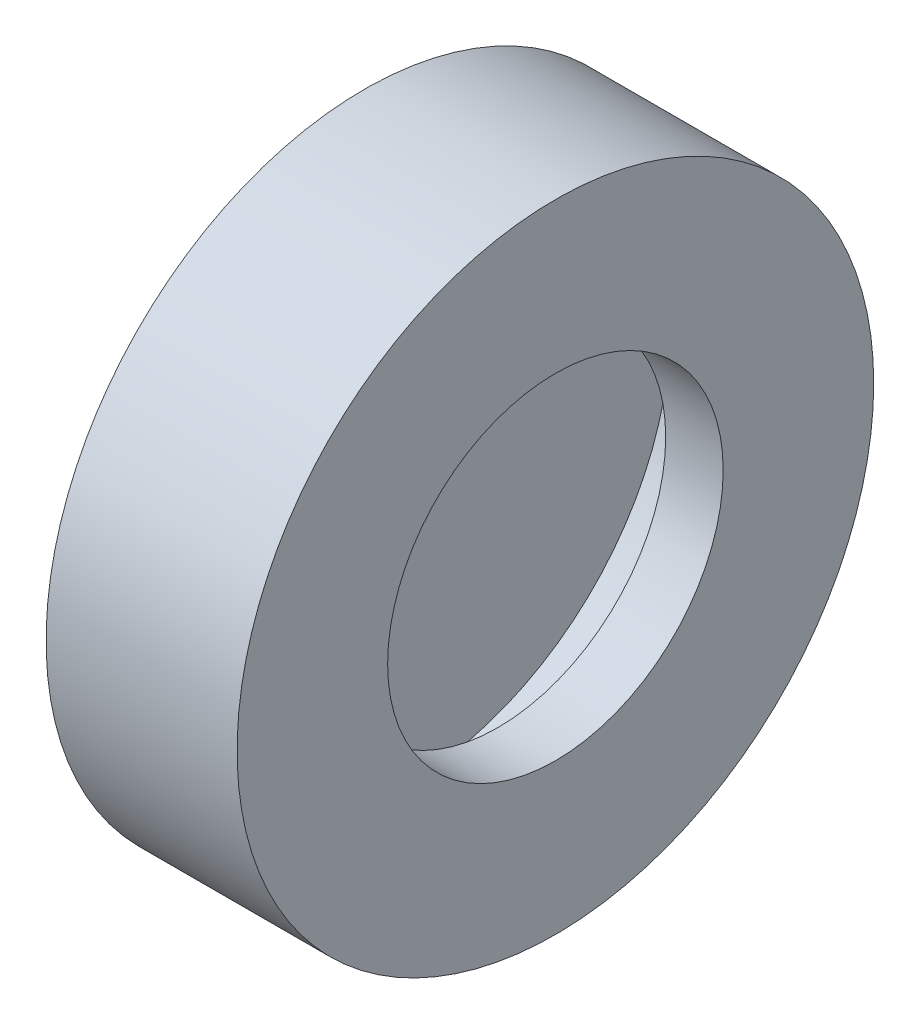
ISO-10303-21;
HEADER;
FILE_DESCRIPTION(('STEP AP214'),'2;1');
FILE_NAME('part.step','',(''),(''),'','','');
FILE_SCHEMA(('AUTOMOTIVE_DESIGN { 1 0 10303 214 1 1 1 1 }'));
ENDSEC;
DATA;
#1=APPLICATION_CONTEXT('core data for automotive mechanical design processes');
#2=APPLICATION_PROTOCOL_DEFINITION('international standard','automotive_design',2000,#1);
#3=PRODUCT_CONTEXT('',#1,'mechanical');
#4=PRODUCT('Part','Part','',(#3));
#5=PRODUCT_RELATED_PRODUCT_CATEGORY('part','',(#4));
#6=PRODUCT_DEFINITION_FORMATION('','',#4);
#7=PRODUCT_DEFINITION_CONTEXT('part definition',#1,'design');
#8=PRODUCT_DEFINITION('design','',#6,#7);
#9=PRODUCT_DEFINITION_SHAPE('','',#8);
#10=(LENGTH_UNIT() NAMED_UNIT(*) SI_UNIT(.MILLI.,.METRE.));
#11=(NAMED_UNIT(*) PLANE_ANGLE_UNIT() SI_UNIT($,.RADIAN.));
#12=(NAMED_UNIT(*) SI_UNIT($,.STERADIAN.) SOLID_ANGLE_UNIT());
#13=UNCERTAINTY_MEASURE_WITH_UNIT(LENGTH_MEASURE(1.E-05),#10,'distance_accuracy_value','');
#14=(GEOMETRIC_REPRESENTATION_CONTEXT(3) GLOBAL_UNCERTAINTY_ASSIGNED_CONTEXT((#13)) GLOBAL_UNIT_ASSIGNED_CONTEXT((#10,
#11,#12)) REPRESENTATION_CONTEXT('',''));
#15=CARTESIAN_POINT('',(0.,0.,0.));
#16=DIRECTION('',(0.,0.,1.));
#17=DIRECTION('',(1.,0.,0.));
#18=AXIS2_PLACEMENT_3D('',#15,#16,#17);
#19=CARTESIAN_POINT('',(3.,0.,0.));
#20=DIRECTION('',(-1.,0.,0.));
#21=DIRECTION('',(0.,0.,1.));
#22=AXIS2_PLACEMENT_3D('',#19,#20,#21);
#23=CYLINDRICAL_SURFACE('',#22,5.);
#24=CARTESIAN_POINT('',(3.,0.,0.));
#25=DIRECTION('',(1.,0.,0.));
#26=DIRECTION('',(0.,0.,-1.));
#27=AXIS2_PLACEMENT_3D('',#24,#25,#26);
#28=CIRCLE('',#27,5.);
#29=CARTESIAN_POINT('',(3.,0.,-5.));
#30=VERTEX_POINT('',#29);
#31=EDGE_CURVE('E10',#30,#30,#28,.T.);
#32=ORIENTED_EDGE('',*,*,#31,.F.);
#33=EDGE_LOOP('',(#32));
#34=FACE_BOUND('',#33,.T.);
#35=CARTESIAN_POINT('',(0.,0.,0.));
#36=DIRECTION('',(1.,0.,0.));
#37=DIRECTION('',(0.,0.,-1.));
#38=AXIS2_PLACEMENT_3D('',#35,#36,#37);
#39=CIRCLE('',#38,5.);
#40=CARTESIAN_POINT('',(0.,0.,-5.));
#41=VERTEX_POINT('',#40);
#42=EDGE_CURVE('E40',#41,#41,#39,.T.);
#43=ORIENTED_EDGE('',*,*,#42,.T.);
#44=EDGE_LOOP('',(#43));
#45=FACE_BOUND('',#44,.T.);
#46=ADVANCED_FACE('F33',(#34,#45),#23,.T.);
#47=CARTESIAN_POINT('',(3.,0.,0.));
#48=DIRECTION('',(1.,0.,0.));
#49=DIRECTION('',(0.,0.,-1.));
#50=AXIS2_PLACEMENT_3D('',#47,#48,#49);
#51=PLANE('',#50);
#52=CARTESIAN_POINT('',(3.,0.,0.));
#53=DIRECTION('',(1.,0.,0.));
#54=DIRECTION('',(0.,0.,-1.));
#55=AXIS2_PLACEMENT_3D('',#52,#53,#54);
#56=CIRCLE('',#55,2.63537478931394);
#57=CARTESIAN_POINT('',(3.,0.,-2.63537478931394));
#58=VERTEX_POINT('',#57);
#59=EDGE_CURVE('E36',#58,#58,#56,.T.);
#60=ORIENTED_EDGE('',*,*,#59,.F.);
#61=EDGE_LOOP('',(#60));
#62=FACE_BOUND('',#61,.T.);
#63=ORIENTED_EDGE('',*,*,#31,.T.);
#64=EDGE_LOOP('',(#63));
#65=FACE_BOUND('',#64,.T.);
#66=ADVANCED_FACE('F78',(#62,#65),#51,.T.);
#67=CARTESIAN_POINT('',(0.,0.,0.));
#68=DIRECTION('',(1.,0.,0.));
#69=DIRECTION('',(0.,0.,-1.));
#70=AXIS2_PLACEMENT_3D('',#67,#68,#69);
#71=PLANE('',#70);
#72=ORIENTED_EDGE('',*,*,#42,.F.);
#73=EDGE_LOOP('',(#72));
#74=FACE_BOUND('',#73,.T.);
#75=ADVANCED_FACE('F72',(#74),#71,.F.);
#76=CARTESIAN_POINT('',(3.61512280825196,0.,0.));
#77=DIRECTION('',(1.,0.,0.));
#78=DIRECTION('',(0.,0.,-1.));
#79=AXIS2_PLACEMENT_3D('',#76,#77,#78);
#80=CYLINDRICAL_SURFACE('',#79,2.63537478931394);
#81=ORIENTED_EDGE('',*,*,#59,.T.);
#82=EDGE_LOOP('',(#81));
#83=FACE_BOUND('',#82,.T.);
#84=CARTESIAN_POINT('',(2.09701047007112,0.,0.));
#85=DIRECTION('',(1.,0.,0.));
#86=DIRECTION('',(0.,0.,-1.));
#87=AXIS2_PLACEMENT_3D('',#84,#85,#86);
#88=CIRCLE('',#87,2.63537478931394);
#89=CARTESIAN_POINT('',(2.09701047007112,0.,-2.63537478931394));
#90=VERTEX_POINT('',#89);
#91=EDGE_CURVE('E46',#90,#90,#88,.T.);
#92=ORIENTED_EDGE('',*,*,#91,.F.);
#93=EDGE_LOOP('',(#92));
#94=FACE_BOUND('',#93,.T.);
#95=ADVANCED_FACE('F67',(#83,#94),#80,.F.);
#96=CARTESIAN_POINT('',(2.09701047007112,0.,-2.63537478931394));
#97=DIRECTION('',(1.,0.,0.));
#98=DIRECTION('',(0.,0.,-1.));
#99=AXIS2_PLACEMENT_3D('',#96,#97,#98);
#100=PLANE('',#99);
#101=CARTESIAN_POINT('',(2.09701047007112,0.,0.));
#102=DIRECTION('',(1.,0.,0.));
#103=DIRECTION('',(0.,0.,-1.));
#104=AXIS2_PLACEMENT_3D('',#101,#102,#103);
#105=CIRCLE('',#104,4.13642968549275);
#106=CARTESIAN_POINT('',(2.09701047007112,0.,-4.13642968549275));
#107=VERTEX_POINT('',#106);
#108=EDGE_CURVE('E49',#107,#107,#105,.T.);
#109=ORIENTED_EDGE('',*,*,#108,.F.);
#110=EDGE_LOOP('',(#109));
#111=FACE_BOUND('',#110,.T.);
#112=ORIENTED_EDGE('',*,*,#91,.T.);
#113=EDGE_LOOP('',(#112));
#114=FACE_BOUND('',#113,.T.);
#115=ADVANCED_FACE('F61',(#111,#114),#100,.F.);
#116=CARTESIAN_POINT('',(3.61512280825196,0.,0.));
#117=DIRECTION('',(1.,0.,0.));
#118=DIRECTION('',(0.,0.,-1.));
#119=AXIS2_PLACEMENT_3D('',#116,#117,#118);
#120=CYLINDRICAL_SURFACE('',#119,4.13642968549275);
#121=CARTESIAN_POINT('',(0.664185341900434,0.,0.));
#122=DIRECTION('',(1.,0.,0.));
#123=DIRECTION('',(0.,0.,-1.));
#124=AXIS2_PLACEMENT_3D('',#121,#122,#123);
#125=CIRCLE('',#124,4.13642968549275);
#126=CARTESIAN_POINT('',(0.664185341900433,0.,-4.13642968549275));
#127=VERTEX_POINT('',#126);
#128=EDGE_CURVE('E52',#127,#127,#125,.T.);
#129=ORIENTED_EDGE('',*,*,#128,.F.);
#130=EDGE_LOOP('',(#129));
#131=FACE_BOUND('',#130,.T.);
#132=ORIENTED_EDGE('',*,*,#108,.T.);
#133=EDGE_LOOP('',(#132));
#134=FACE_BOUND('',#133,.T.);
#135=ADVANCED_FACE('F58',(#131,#134),#120,.F.);
#136=CARTESIAN_POINT('',(0.664185341900433,0.,0.));
#137=DIRECTION('',(-1.,0.,0.));
#138=DIRECTION('',(0.,0.,1.));
#139=AXIS2_PLACEMENT_3D('',#136,#137,#138);
#140=PLANE('',#139);
#141=ORIENTED_EDGE('',*,*,#128,.T.);
#142=EDGE_LOOP('',(#141));
#143=FACE_BOUND('',#142,.T.);
#144=ADVANCED_FACE('F56',(#143),#140,.F.);
#145=CLOSED_SHELL('',(#46,#66,#75,#95,#115,#135,#144));
#146=MANIFOLD_SOLID_BREP('B2',#145);
#147=ADVANCED_BREP_SHAPE_REPRESENTATION('',(#18,#146),#14);
#148=SHAPE_DEFINITION_REPRESENTATION(#9,#147);
ENDSEC;
END-ISO-10303-21;
